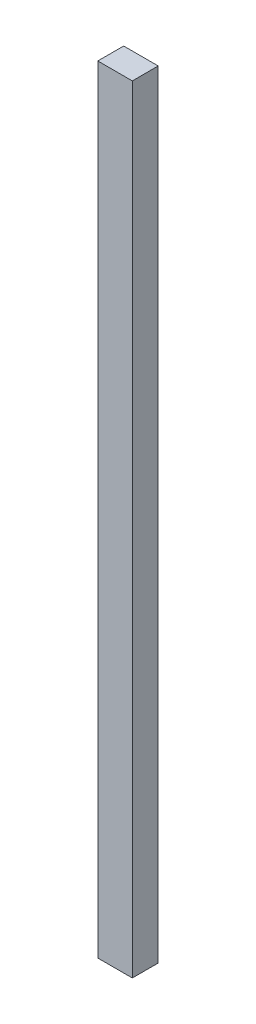
ISO-10303-21;
HEADER;
FILE_DESCRIPTION(('STEP AP214'),'2;1');
FILE_NAME('part.step','',(''),(''),'','','');
FILE_SCHEMA(('AUTOMOTIVE_DESIGN { 1 0 10303 214 1 1 1 1 }'));
ENDSEC;
DATA;
#1=APPLICATION_CONTEXT('core data for automotive mechanical design processes');
#2=APPLICATION_PROTOCOL_DEFINITION('international standard','automotive_design',2000,#1);
#3=PRODUCT_CONTEXT('',#1,'mechanical');
#4=PRODUCT('Part','Part','',(#3));
#5=PRODUCT_RELATED_PRODUCT_CATEGORY('part','',(#4));
#6=PRODUCT_DEFINITION_FORMATION('','',#4);
#7=PRODUCT_DEFINITION_CONTEXT('part definition',#1,'design');
#8=PRODUCT_DEFINITION('design','',#6,#7);
#9=PRODUCT_DEFINITION_SHAPE('','',#8);
#10=(LENGTH_UNIT() NAMED_UNIT(*) SI_UNIT(.MILLI.,.METRE.));
#11=(NAMED_UNIT(*) PLANE_ANGLE_UNIT() SI_UNIT($,.RADIAN.));
#12=(NAMED_UNIT(*) SI_UNIT($,.STERADIAN.) SOLID_ANGLE_UNIT());
#13=UNCERTAINTY_MEASURE_WITH_UNIT(LENGTH_MEASURE(1.E-05),#10,'distance_accuracy_value','');
#14=(GEOMETRIC_REPRESENTATION_CONTEXT(3) GLOBAL_UNCERTAINTY_ASSIGNED_CONTEXT((#13)) GLOBAL_UNIT_ASSIGNED_CONTEXT((#10,
#11,#12)) REPRESENTATION_CONTEXT('',''));
#15=CARTESIAN_POINT('',(0.,0.,0.));
#16=DIRECTION('',(0.,0.,1.));
#17=DIRECTION('',(1.,0.,0.));
#18=AXIS2_PLACEMENT_3D('',#15,#16,#17);
#19=CARTESIAN_POINT('',(0.,0.,3.));
#20=DIRECTION('',(1.,0.,0.));
#21=DIRECTION('',(0.,0.,-1.));
#22=AXIS2_PLACEMENT_3D('',#19,#20,#21);
#23=PLANE('',#22);
#24=DIRECTION('',(0.,-1.,0.));
#25=VECTOR('',#24,1.);
#26=CARTESIAN_POINT('',(0.,0.,0.));
#27=LINE('',#26,#25);
#28=CARTESIAN_POINT('',(0.,90.,0.));
#29=VERTEX_POINT('',#28);
#30=CARTESIAN_POINT('',(0.,0.,0.));
#31=VERTEX_POINT('',#30);
#32=EDGE_CURVE('E96',#29,#31,#27,.T.);
#33=ORIENTED_EDGE('',*,*,#32,.T.);
#34=DIRECTION('',(0.,0.,-1.));
#35=VECTOR('',#34,1.);
#36=CARTESIAN_POINT('',(0.,0.,3.));
#37=LINE('',#36,#35);
#38=CARTESIAN_POINT('',(0.,0.,3.));
#39=VERTEX_POINT('',#38);
#40=EDGE_CURVE('E11',#39,#31,#37,.T.);
#41=ORIENTED_EDGE('',*,*,#40,.F.);
#42=DIRECTION('',(0.,-1.,0.));
#43=VECTOR('',#42,1.);
#44=CARTESIAN_POINT('',(0.,0.,3.));
#45=LINE('',#44,#43);
#46=CARTESIAN_POINT('',(0.,90.,3.));
#47=VERTEX_POINT('',#46);
#48=EDGE_CURVE('E84',#47,#39,#45,.T.);
#49=ORIENTED_EDGE('',*,*,#48,.F.);
#50=DIRECTION('',(0.,0.,-1.));
#51=VECTOR('',#50,1.);
#52=CARTESIAN_POINT('',(0.,90.,3.));
#53=LINE('',#52,#51);
#54=EDGE_CURVE('E92',#47,#29,#53,.T.);
#55=ORIENTED_EDGE('',*,*,#54,.T.);
#56=EDGE_LOOP('',(#33,#41,#49,#55));
#57=FACE_BOUND('',#56,.T.);
#58=ADVANCED_FACE('F33',(#57),#23,.F.);
#59=CARTESIAN_POINT('',(0.,0.,3.));
#60=DIRECTION('',(0.,1.,0.));
#61=DIRECTION('',(0.,0.,1.));
#62=AXIS2_PLACEMENT_3D('',#59,#60,#61);
#63=PLANE('',#62);
#64=DIRECTION('',(1.,0.,0.));
#65=VECTOR('',#64,1.);
#66=CARTESIAN_POINT('',(0.,0.,0.));
#67=LINE('',#66,#65);
#68=CARTESIAN_POINT('',(4.,0.,0.));
#69=VERTEX_POINT('',#68);
#70=EDGE_CURVE('E88',#31,#69,#67,.T.);
#71=ORIENTED_EDGE('',*,*,#70,.T.);
#72=DIRECTION('',(0.,0.,-1.));
#73=VECTOR('',#72,1.);
#74=CARTESIAN_POINT('',(4.,0.,3.));
#75=LINE('',#74,#73);
#76=CARTESIAN_POINT('',(4.,0.,3.));
#77=VERTEX_POINT('',#76);
#78=EDGE_CURVE('E41',#77,#69,#75,.T.);
#79=ORIENTED_EDGE('',*,*,#78,.F.);
#80=DIRECTION('',(1.,0.,0.));
#81=VECTOR('',#80,1.);
#82=CARTESIAN_POINT('',(0.,0.,3.));
#83=LINE('',#82,#81);
#84=EDGE_CURVE('E79',#39,#77,#83,.T.);
#85=ORIENTED_EDGE('',*,*,#84,.F.);
#86=ORIENTED_EDGE('',*,*,#40,.T.);
#87=EDGE_LOOP('',(#71,#79,#85,#86));
#88=FACE_BOUND('',#87,.T.);
#89=ADVANCED_FACE('F87',(#88),#63,.F.);
#90=CARTESIAN_POINT('',(4.,0.,3.));
#91=DIRECTION('',(-1.,0.,0.));
#92=DIRECTION('',(0.,0.,1.));
#93=AXIS2_PLACEMENT_3D('',#90,#91,#92);
#94=PLANE('',#93);
#95=DIRECTION('',(0.,1.,0.));
#96=VECTOR('',#95,1.);
#97=CARTESIAN_POINT('',(4.,0.,0.));
#98=LINE('',#97,#96);
#99=CARTESIAN_POINT('',(4.,90.,0.));
#100=VERTEX_POINT('',#99);
#101=EDGE_CURVE('E66',#69,#100,#98,.T.);
#102=ORIENTED_EDGE('',*,*,#101,.T.);
#103=DIRECTION('',(0.,0.,-1.));
#104=VECTOR('',#103,1.);
#105=CARTESIAN_POINT('',(4.,90.,3.));
#106=LINE('',#105,#104);
#107=CARTESIAN_POINT('',(4.,90.,3.));
#108=VERTEX_POINT('',#107);
#109=EDGE_CURVE('E89',#108,#100,#106,.T.);
#110=ORIENTED_EDGE('',*,*,#109,.F.);
#111=DIRECTION('',(0.,1.,0.));
#112=VECTOR('',#111,1.);
#113=CARTESIAN_POINT('',(4.,0.,3.));
#114=LINE('',#113,#112);
#115=EDGE_CURVE('E82',#77,#108,#114,.T.);
#116=ORIENTED_EDGE('',*,*,#115,.F.);
#117=ORIENTED_EDGE('',*,*,#78,.T.);
#118=EDGE_LOOP('',(#102,#110,#116,#117));
#119=FACE_BOUND('',#118,.T.);
#120=ADVANCED_FACE('F90',(#119),#94,.F.);
#121=CARTESIAN_POINT('',(0.,90.,3.));
#122=DIRECTION('',(0.,-1.,0.));
#123=DIRECTION('',(0.,0.,-1.));
#124=AXIS2_PLACEMENT_3D('',#121,#122,#123);
#125=PLANE('',#124);
#126=DIRECTION('',(-1.,0.,0.));
#127=VECTOR('',#126,1.);
#128=CARTESIAN_POINT('',(0.,90.,0.));
#129=LINE('',#128,#127);
#130=EDGE_CURVE('E72',#100,#29,#129,.T.);
#131=ORIENTED_EDGE('',*,*,#130,.T.);
#132=ORIENTED_EDGE('',*,*,#54,.F.);
#133=DIRECTION('',(-1.,0.,0.));
#134=VECTOR('',#133,1.);
#135=CARTESIAN_POINT('',(0.,90.,3.));
#136=LINE('',#135,#134);
#137=EDGE_CURVE('E49',#108,#47,#136,.T.);
#138=ORIENTED_EDGE('',*,*,#137,.F.);
#139=ORIENTED_EDGE('',*,*,#109,.T.);
#140=EDGE_LOOP('',(#131,#132,#138,#139));
#141=FACE_BOUND('',#140,.T.);
#142=ADVANCED_FACE('F103',(#141),#125,.F.);
#143=CARTESIAN_POINT('',(0.,0.,3.));
#144=DIRECTION('',(0.,0.,-1.));
#145=DIRECTION('',(-1.,0.,0.));
#146=AXIS2_PLACEMENT_3D('',#143,#144,#145);
#147=PLANE('',#146);
#148=ORIENTED_EDGE('',*,*,#48,.T.);
#149=ORIENTED_EDGE('',*,*,#84,.T.);
#150=ORIENTED_EDGE('',*,*,#115,.T.);
#151=ORIENTED_EDGE('',*,*,#137,.T.);
#152=EDGE_LOOP('',(#148,#149,#150,#151));
#153=FACE_BOUND('',#152,.T.);
#154=ADVANCED_FACE('F80',(#153),#147,.F.);
#155=CARTESIAN_POINT('',(0.,0.,0.));
#156=DIRECTION('',(0.,0.,-1.));
#157=DIRECTION('',(-1.,0.,0.));
#158=AXIS2_PLACEMENT_3D('',#155,#156,#157);
#159=PLANE('',#158);
#160=ORIENTED_EDGE('',*,*,#32,.F.);
#161=ORIENTED_EDGE('',*,*,#130,.F.);
#162=ORIENTED_EDGE('',*,*,#101,.F.);
#163=ORIENTED_EDGE('',*,*,#70,.F.);
#164=EDGE_LOOP('',(#160,#161,#162,#163));
#165=FACE_BOUND('',#164,.T.);
#166=ADVANCED_FACE('F106',(#165),#159,.T.);
#167=CLOSED_SHELL('',(#58,#89,#120,#142,#154,#166));
#168=MANIFOLD_SOLID_BREP('B2',#167);
#169=ADVANCED_BREP_SHAPE_REPRESENTATION('',(#18,#168),#14);
#170=SHAPE_DEFINITION_REPRESENTATION(#9,#169);
ENDSEC;
END-ISO-10303-21;
